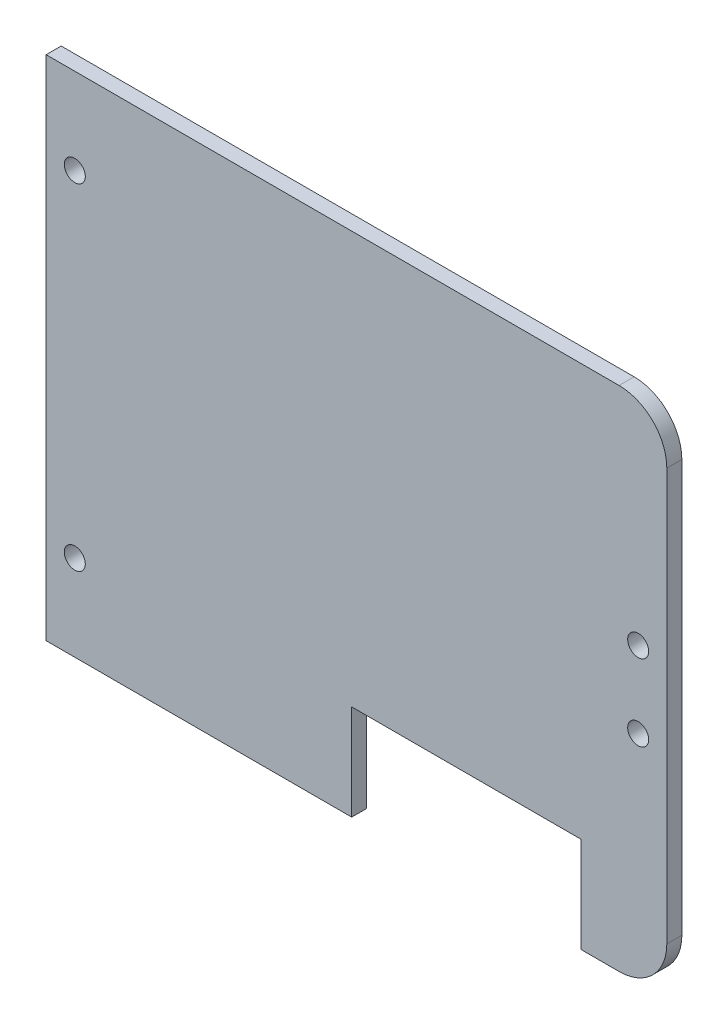
ISO-10303-21;
HEADER;
FILE_DESCRIPTION(('STEP AP214'),'2;1');
FILE_NAME('part.step','',(''),(''),'','','');
FILE_SCHEMA(('AUTOMOTIVE_DESIGN { 1 0 10303 214 1 1 1 1 }'));
ENDSEC;
DATA;
#1=APPLICATION_CONTEXT('core data for automotive mechanical design processes');
#2=APPLICATION_PROTOCOL_DEFINITION('international standard','automotive_design',2000,#1);
#3=PRODUCT_CONTEXT('',#1,'mechanical');
#4=PRODUCT('Part','Part','',(#3));
#5=PRODUCT_RELATED_PRODUCT_CATEGORY('part','',(#4));
#6=PRODUCT_DEFINITION_FORMATION('','',#4);
#7=PRODUCT_DEFINITION_CONTEXT('part definition',#1,'design');
#8=PRODUCT_DEFINITION('design','',#6,#7);
#9=PRODUCT_DEFINITION_SHAPE('','',#8);
#10=(LENGTH_UNIT() NAMED_UNIT(*) SI_UNIT(.MILLI.,.METRE.));
#11=(NAMED_UNIT(*) PLANE_ANGLE_UNIT() SI_UNIT($,.RADIAN.));
#12=(NAMED_UNIT(*) SI_UNIT($,.STERADIAN.) SOLID_ANGLE_UNIT());
#13=UNCERTAINTY_MEASURE_WITH_UNIT(LENGTH_MEASURE(1.E-05),#10,'distance_accuracy_value','');
#14=(GEOMETRIC_REPRESENTATION_CONTEXT(3) GLOBAL_UNCERTAINTY_ASSIGNED_CONTEXT((#13)) GLOBAL_UNIT_ASSIGNED_CONTEXT((#10,
#11,#12)) REPRESENTATION_CONTEXT('',''));
#15=CARTESIAN_POINT('',(0.,0.,0.));
#16=DIRECTION('',(0.,0.,1.));
#17=DIRECTION('',(1.,0.,0.));
#18=AXIS2_PLACEMENT_3D('',#15,#16,#17);
#19=CARTESIAN_POINT('',(60.,48.15,-1.5748));
#20=DIRECTION('',(0.,0.,1.));
#21=DIRECTION('',(1.,0.,0.));
#22=AXIS2_PLACEMENT_3D('',#19,#20,#21);
#23=CYLINDRICAL_SURFACE('',#22,5.);
#24=CARTESIAN_POINT('',(60.,48.15,0.));
#25=DIRECTION('',(0.,0.,1.));
#26=DIRECTION('',(1.,0.,0.));
#27=AXIS2_PLACEMENT_3D('',#24,#25,#26);
#28=CIRCLE('',#27,5.);
#29=CARTESIAN_POINT('',(65.,48.15,0.));
#30=VERTEX_POINT('',#29);
#31=CARTESIAN_POINT('',(60.,53.15,0.));
#32=VERTEX_POINT('',#31);
#33=EDGE_CURVE('E143',#30,#32,#28,.T.);
#34=ORIENTED_EDGE('',*,*,#33,.F.);
#35=DIRECTION('',(0.,0.,1.));
#36=VECTOR('',#35,1.);
#37=CARTESIAN_POINT('',(65.,48.15,-1.5748));
#38=LINE('',#37,#36);
#39=CARTESIAN_POINT('',(65.,48.15,-1.5748));
#40=VERTEX_POINT('',#39);
#41=EDGE_CURVE('E11',#40,#30,#38,.T.);
#42=ORIENTED_EDGE('',*,*,#41,.F.);
#43=CARTESIAN_POINT('',(60.,48.15,-1.5748));
#44=DIRECTION('',(0.,0.,1.));
#45=DIRECTION('',(1.,0.,0.));
#46=AXIS2_PLACEMENT_3D('',#43,#44,#45);
#47=CIRCLE('',#46,5.);
#48=CARTESIAN_POINT('',(60.,53.15,-1.5748));
#49=VERTEX_POINT('',#48);
#50=EDGE_CURVE('E170',#40,#49,#47,.T.);
#51=ORIENTED_EDGE('',*,*,#50,.T.);
#52=DIRECTION('',(0.,0.,1.));
#53=VECTOR('',#52,1.);
#54=CARTESIAN_POINT('',(60.,53.15,-1.5748));
#55=LINE('',#54,#53);
#56=EDGE_CURVE('E37',#49,#32,#55,.T.);
#57=ORIENTED_EDGE('',*,*,#56,.T.);
#58=EDGE_LOOP('',(#34,#42,#51,#57));
#59=FACE_BOUND('',#58,.T.);
#60=ADVANCED_FACE('F34',(#59),#23,.T.);
#61=CARTESIAN_POINT('',(65.,48.15,-1.5748));
#62=DIRECTION('',(1.,0.,0.));
#63=DIRECTION('',(0.,0.,-1.));
#64=AXIS2_PLACEMENT_3D('',#61,#62,#63);
#65=PLANE('',#64);
#66=DIRECTION('',(0.,1.,0.));
#67=VECTOR('',#66,1.);
#68=CARTESIAN_POINT('',(65.,48.15,0.));
#69=LINE('',#68,#67);
#70=CARTESIAN_POINT('',(65.,5.,0.));
#71=VERTEX_POINT('',#70);
#72=EDGE_CURVE('E168',#71,#30,#69,.T.);
#73=ORIENTED_EDGE('',*,*,#72,.F.);
#74=DIRECTION('',(0.,0.,1.));
#75=VECTOR('',#74,1.);
#76=CARTESIAN_POINT('',(65.,5.,-1.5748));
#77=LINE('',#76,#75);
#78=CARTESIAN_POINT('',(65.,5.,-1.5748));
#79=VERTEX_POINT('',#78);
#80=EDGE_CURVE('E43',#79,#71,#77,.T.);
#81=ORIENTED_EDGE('',*,*,#80,.F.);
#82=DIRECTION('',(0.,1.,0.));
#83=VECTOR('',#82,1.);
#84=CARTESIAN_POINT('',(65.,48.15,-1.5748));
#85=LINE('',#84,#83);
#86=EDGE_CURVE('E133',#79,#40,#85,.T.);
#87=ORIENTED_EDGE('',*,*,#86,.T.);
#88=ORIENTED_EDGE('',*,*,#41,.T.);
#89=EDGE_LOOP('',(#73,#81,#87,#88));
#90=FACE_BOUND('',#89,.T.);
#91=ADVANCED_FACE('F186',(#90),#65,.T.);
#92=CARTESIAN_POINT('',(60.,5.,-1.5748));
#93=DIRECTION('',(0.,0.,1.));
#94=DIRECTION('',(1.,0.,0.));
#95=AXIS2_PLACEMENT_3D('',#92,#93,#94);
#96=CYLINDRICAL_SURFACE('',#95,5.);
#97=CARTESIAN_POINT('',(60.,5.,0.));
#98=DIRECTION('',(0.,0.,1.));
#99=DIRECTION('',(1.,0.,0.));
#100=AXIS2_PLACEMENT_3D('',#97,#98,#99);
#101=CIRCLE('',#100,5.);
#102=CARTESIAN_POINT('',(60.,0.,0.));
#103=VERTEX_POINT('',#102);
#104=EDGE_CURVE('E120',#103,#71,#101,.T.);
#105=ORIENTED_EDGE('',*,*,#104,.F.);
#106=DIRECTION('',(0.,0.,1.));
#107=VECTOR('',#106,1.);
#108=CARTESIAN_POINT('',(60.,0.,-1.5748));
#109=LINE('',#108,#107);
#110=CARTESIAN_POINT('',(60.,0.,-1.5748));
#111=VERTEX_POINT('',#110);
#112=EDGE_CURVE('E115',#111,#103,#109,.T.);
#113=ORIENTED_EDGE('',*,*,#112,.F.);
#114=CARTESIAN_POINT('',(60.,5.,-1.5748));
#115=DIRECTION('',(0.,0.,1.));
#116=DIRECTION('',(1.,0.,0.));
#117=AXIS2_PLACEMENT_3D('',#114,#115,#116);
#118=CIRCLE('',#117,5.);
#119=EDGE_CURVE('E118',#111,#79,#118,.T.);
#120=ORIENTED_EDGE('',*,*,#119,.T.);
#121=ORIENTED_EDGE('',*,*,#80,.T.);
#122=EDGE_LOOP('',(#105,#113,#120,#121));
#123=FACE_BOUND('',#122,.T.);
#124=ADVANCED_FACE('F117',(#123),#96,.T.);
#125=CARTESIAN_POINT('',(60.,0.,-1.5748));
#126=DIRECTION('',(0.,-1.,0.));
#127=DIRECTION('',(0.,0.,-1.));
#128=AXIS2_PLACEMENT_3D('',#125,#126,#127);
#129=PLANE('',#128);
#130=DIRECTION('',(1.,0.,0.));
#131=VECTOR('',#130,1.);
#132=CARTESIAN_POINT('',(60.,0.,0.));
#133=LINE('',#132,#131);
#134=CARTESIAN_POINT('',(56.,0.,0.));
#135=VERTEX_POINT('',#134);
#136=EDGE_CURVE('E165',#135,#103,#133,.T.);
#137=ORIENTED_EDGE('',*,*,#136,.F.);
#138=DIRECTION('',(0.,0.,1.));
#139=VECTOR('',#138,1.);
#140=CARTESIAN_POINT('',(56.,0.,-1.5748));
#141=LINE('',#140,#139);
#142=CARTESIAN_POINT('',(56.,0.,-1.5748));
#143=VERTEX_POINT('',#142);
#144=EDGE_CURVE('E125',#143,#135,#141,.T.);
#145=ORIENTED_EDGE('',*,*,#144,.F.);
#146=DIRECTION('',(1.,0.,0.));
#147=VECTOR('',#146,1.);
#148=CARTESIAN_POINT('',(60.,0.,-1.5748));
#149=LINE('',#148,#147);
#150=EDGE_CURVE('E131',#143,#111,#149,.T.);
#151=ORIENTED_EDGE('',*,*,#150,.T.);
#152=ORIENTED_EDGE('',*,*,#112,.T.);
#153=EDGE_LOOP('',(#137,#145,#151,#152));
#154=FACE_BOUND('',#153,.T.);
#155=ADVANCED_FACE('F135',(#154),#129,.T.);
#156=CARTESIAN_POINT('',(56.,0.,-1.5748));
#157=DIRECTION('',(-1.,0.,0.));
#158=DIRECTION('',(0.,0.,1.));
#159=AXIS2_PLACEMENT_3D('',#156,#157,#158);
#160=PLANE('',#159);
#161=DIRECTION('',(0.,-1.,0.));
#162=VECTOR('',#161,1.);
#163=CARTESIAN_POINT('',(56.,0.,0.));
#164=LINE('',#163,#162);
#165=CARTESIAN_POINT('',(56.,10.,0.));
#166=VERTEX_POINT('',#165);
#167=EDGE_CURVE('E162',#166,#135,#164,.T.);
#168=ORIENTED_EDGE('',*,*,#167,.F.);
#169=DIRECTION('',(0.,0.,1.));
#170=VECTOR('',#169,1.);
#171=CARTESIAN_POINT('',(56.,10.,-1.5748));
#172=LINE('',#171,#170);
#173=CARTESIAN_POINT('',(56.,10.,-1.5748));
#174=VERTEX_POINT('',#173);
#175=EDGE_CURVE('E174',#174,#166,#172,.T.);
#176=ORIENTED_EDGE('',*,*,#175,.F.);
#177=DIRECTION('',(0.,-1.,0.));
#178=VECTOR('',#177,1.);
#179=CARTESIAN_POINT('',(56.,0.,-1.5748));
#180=LINE('',#179,#178);
#181=EDGE_CURVE('E136',#174,#143,#180,.T.);
#182=ORIENTED_EDGE('',*,*,#181,.T.);
#183=ORIENTED_EDGE('',*,*,#144,.T.);
#184=EDGE_LOOP('',(#168,#176,#182,#183));
#185=FACE_BOUND('',#184,.T.);
#186=ADVANCED_FACE('F199',(#185),#160,.T.);
#187=CARTESIAN_POINT('',(56.,10.,-1.5748));
#188=DIRECTION('',(0.,-1.,0.));
#189=DIRECTION('',(0.,0.,-1.));
#190=AXIS2_PLACEMENT_3D('',#187,#188,#189);
#191=PLANE('',#190);
#192=DIRECTION('',(1.,0.,0.));
#193=VECTOR('',#192,1.);
#194=CARTESIAN_POINT('',(56.,10.,0.));
#195=LINE('',#194,#193);
#196=CARTESIAN_POINT('',(32.,10.,0.));
#197=VERTEX_POINT('',#196);
#198=EDGE_CURVE('E159',#197,#166,#195,.T.);
#199=ORIENTED_EDGE('',*,*,#198,.F.);
#200=DIRECTION('',(0.,0.,1.));
#201=VECTOR('',#200,1.);
#202=CARTESIAN_POINT('',(32.,10.,-1.5748));
#203=LINE('',#202,#201);
#204=CARTESIAN_POINT('',(32.,10.,-1.5748));
#205=VERTEX_POINT('',#204);
#206=EDGE_CURVE('E176',#205,#197,#203,.T.);
#207=ORIENTED_EDGE('',*,*,#206,.F.);
#208=DIRECTION('',(1.,0.,0.));
#209=VECTOR('',#208,1.);
#210=CARTESIAN_POINT('',(56.,10.,-1.5748));
#211=LINE('',#210,#209);
#212=EDGE_CURVE('E138',#205,#174,#211,.T.);
#213=ORIENTED_EDGE('',*,*,#212,.T.);
#214=ORIENTED_EDGE('',*,*,#175,.T.);
#215=EDGE_LOOP('',(#199,#207,#213,#214));
#216=FACE_BOUND('',#215,.T.);
#217=ADVANCED_FACE('F202',(#216),#191,.T.);
#218=CARTESIAN_POINT('',(32.,10.,-1.5748));
#219=DIRECTION('',(1.,0.,0.));
#220=DIRECTION('',(0.,0.,-1.));
#221=AXIS2_PLACEMENT_3D('',#218,#219,#220);
#222=PLANE('',#221);
#223=DIRECTION('',(0.,1.,0.));
#224=VECTOR('',#223,1.);
#225=CARTESIAN_POINT('',(32.,10.,0.));
#226=LINE('',#225,#224);
#227=CARTESIAN_POINT('',(32.,0.,0.));
#228=VERTEX_POINT('',#227);
#229=EDGE_CURVE('E156',#228,#197,#226,.T.);
#230=ORIENTED_EDGE('',*,*,#229,.F.);
#231=DIRECTION('',(0.,0.,1.));
#232=VECTOR('',#231,1.);
#233=CARTESIAN_POINT('',(32.,0.,-1.5748));
#234=LINE('',#233,#232);
#235=CARTESIAN_POINT('',(32.,0.,-1.5748));
#236=VERTEX_POINT('',#235);
#237=EDGE_CURVE('E178',#236,#228,#234,.T.);
#238=ORIENTED_EDGE('',*,*,#237,.F.);
#239=DIRECTION('',(0.,1.,0.));
#240=VECTOR('',#239,1.);
#241=CARTESIAN_POINT('',(32.,10.,-1.5748));
#242=LINE('',#241,#240);
#243=EDGE_CURVE('E282',#236,#205,#242,.T.);
#244=ORIENTED_EDGE('',*,*,#243,.T.);
#245=ORIENTED_EDGE('',*,*,#206,.T.);
#246=EDGE_LOOP('',(#230,#238,#244,#245));
#247=FACE_BOUND('',#246,.T.);
#248=ADVANCED_FACE('F206',(#247),#222,.T.);
#249=CARTESIAN_POINT('',(32.,0.,-1.5748));
#250=DIRECTION('',(0.,-1.,0.));
#251=DIRECTION('',(0.,0.,-1.));
#252=AXIS2_PLACEMENT_3D('',#249,#250,#251);
#253=PLANE('',#252);
#254=DIRECTION('',(1.,0.,0.));
#255=VECTOR('',#254,1.);
#256=CARTESIAN_POINT('',(32.,0.,0.));
#257=LINE('',#256,#255);
#258=CARTESIAN_POINT('',(0.,0.,0.));
#259=VERTEX_POINT('',#258);
#260=EDGE_CURVE('E153',#259,#228,#257,.T.);
#261=ORIENTED_EDGE('',*,*,#260,.F.);
#262=DIRECTION('',(0.,0.,1.));
#263=VECTOR('',#262,1.);
#264=CARTESIAN_POINT('',(0.,0.,-1.5748));
#265=LINE('',#264,#263);
#266=CARTESIAN_POINT('',(0.,0.,-1.5748));
#267=VERTEX_POINT('',#266);
#268=EDGE_CURVE('E180',#267,#259,#265,.T.);
#269=ORIENTED_EDGE('',*,*,#268,.F.);
#270=DIRECTION('',(1.,0.,0.));
#271=VECTOR('',#270,1.);
#272=CARTESIAN_POINT('',(32.,0.,-1.5748));
#273=LINE('',#272,#271);
#274=EDGE_CURVE('E279',#267,#236,#273,.T.);
#275=ORIENTED_EDGE('',*,*,#274,.T.);
#276=ORIENTED_EDGE('',*,*,#237,.T.);
#277=EDGE_LOOP('',(#261,#269,#275,#276));
#278=FACE_BOUND('',#277,.T.);
#279=ADVANCED_FACE('F210',(#278),#253,.T.);
#280=CARTESIAN_POINT('',(0.,0.,-1.5748));
#281=DIRECTION('',(-1.,0.,0.));
#282=DIRECTION('',(0.,0.,1.));
#283=AXIS2_PLACEMENT_3D('',#280,#281,#282);
#284=PLANE('',#283);
#285=DIRECTION('',(0.,-1.,0.));
#286=VECTOR('',#285,1.);
#287=CARTESIAN_POINT('',(0.,0.,0.));
#288=LINE('',#287,#286);
#289=CARTESIAN_POINT('',(0.,53.15,0.));
#290=VERTEX_POINT('',#289);
#291=EDGE_CURVE('E150',#290,#259,#288,.T.);
#292=ORIENTED_EDGE('',*,*,#291,.F.);
#293=DIRECTION('',(0.,0.,1.));
#294=VECTOR('',#293,1.);
#295=CARTESIAN_POINT('',(0.,53.15,-1.5748));
#296=LINE('',#295,#294);
#297=CARTESIAN_POINT('',(0.,53.15,-1.5748));
#298=VERTEX_POINT('',#297);
#299=EDGE_CURVE('E181',#298,#290,#296,.T.);
#300=ORIENTED_EDGE('',*,*,#299,.F.);
#301=DIRECTION('',(0.,-1.,0.));
#302=VECTOR('',#301,1.);
#303=CARTESIAN_POINT('',(0.,0.,-1.5748));
#304=LINE('',#303,#302);
#305=EDGE_CURVE('E276',#298,#267,#304,.T.);
#306=ORIENTED_EDGE('',*,*,#305,.T.);
#307=ORIENTED_EDGE('',*,*,#268,.T.);
#308=EDGE_LOOP('',(#292,#300,#306,#307));
#309=FACE_BOUND('',#308,.T.);
#310=ADVANCED_FACE('F214',(#309),#284,.T.);
#311=CARTESIAN_POINT('',(0.,53.15,-1.5748));
#312=DIRECTION('',(0.,1.,0.));
#313=DIRECTION('',(0.,0.,1.));
#314=AXIS2_PLACEMENT_3D('',#311,#312,#313);
#315=PLANE('',#314);
#316=DIRECTION('',(-1.,0.,0.));
#317=VECTOR('',#316,1.);
#318=CARTESIAN_POINT('',(0.,53.15,0.));
#319=LINE('',#318,#317);
#320=EDGE_CURVE('E146',#32,#290,#319,.T.);
#321=ORIENTED_EDGE('',*,*,#320,.F.);
#322=ORIENTED_EDGE('',*,*,#56,.F.);
#323=DIRECTION('',(-1.,0.,0.));
#324=VECTOR('',#323,1.);
#325=CARTESIAN_POINT('',(0.,53.15,-1.5748));
#326=LINE('',#325,#324);
#327=EDGE_CURVE('E274',#49,#298,#326,.T.);
#328=ORIENTED_EDGE('',*,*,#327,.T.);
#329=ORIENTED_EDGE('',*,*,#299,.T.);
#330=EDGE_LOOP('',(#321,#322,#328,#329));
#331=FACE_BOUND('',#330,.T.);
#332=ADVANCED_FACE('F183',(#331),#315,.T.);
#333=CARTESIAN_POINT('',(60.,48.15,-1.5748));
#334=DIRECTION('',(0.,0.,1.));
#335=DIRECTION('',(1.,0.,0.));
#336=AXIS2_PLACEMENT_3D('',#333,#334,#335);
#337=PLANE('',#336);
#338=CARTESIAN_POINT('',(62.,30.575,-1.5748));
#339=DIRECTION('',(0.,0.,1.));
#340=DIRECTION('',(1.,0.,0.));
#341=AXIS2_PLACEMENT_3D('',#338,#339,#340);
#342=CIRCLE('',#341,1.1);
#343=CARTESIAN_POINT('',(63.1,30.575,-1.5748));
#344=VERTEX_POINT('',#343);
#345=EDGE_CURVE('E249',#344,#344,#342,.T.);
#346=ORIENTED_EDGE('',*,*,#345,.T.);
#347=EDGE_LOOP('',(#346));
#348=FACE_BOUND('',#347,.T.);
#349=CARTESIAN_POINT('',(3.,44.15,-1.5748));
#350=DIRECTION('',(0.,0.,1.));
#351=DIRECTION('',(1.,0.,0.));
#352=AXIS2_PLACEMENT_3D('',#349,#350,#351);
#353=CIRCLE('',#352,1.1);
#354=CARTESIAN_POINT('',(4.1,44.15,-1.5748));
#355=VERTEX_POINT('',#354);
#356=EDGE_CURVE('E257',#355,#355,#353,.T.);
#357=ORIENTED_EDGE('',*,*,#356,.T.);
#358=EDGE_LOOP('',(#357));
#359=FACE_BOUND('',#358,.T.);
#360=CARTESIAN_POINT('',(62.,22.575,-1.5748));
#361=DIRECTION('',(0.,0.,1.));
#362=DIRECTION('',(1.,0.,0.));
#363=AXIS2_PLACEMENT_3D('',#360,#361,#362);
#364=CIRCLE('',#363,1.1);
#365=CARTESIAN_POINT('',(63.1,22.575,-1.5748));
#366=VERTEX_POINT('',#365);
#367=EDGE_CURVE('E263',#366,#366,#364,.T.);
#368=ORIENTED_EDGE('',*,*,#367,.T.);
#369=EDGE_LOOP('',(#368));
#370=FACE_BOUND('',#369,.T.);
#371=CARTESIAN_POINT('',(3.,9.,-1.5748));
#372=DIRECTION('',(0.,0.,1.));
#373=DIRECTION('',(1.,0.,0.));
#374=AXIS2_PLACEMENT_3D('',#371,#372,#373);
#375=CIRCLE('',#374,1.1);
#376=CARTESIAN_POINT('',(4.1,9.,-1.5748));
#377=VERTEX_POINT('',#376);
#378=EDGE_CURVE('E147',#377,#377,#375,.T.);
#379=ORIENTED_EDGE('',*,*,#378,.T.);
#380=EDGE_LOOP('',(#379));
#381=FACE_BOUND('',#380,.T.);
#382=ORIENTED_EDGE('',*,*,#50,.F.);
#383=ORIENTED_EDGE('',*,*,#86,.F.);
#384=ORIENTED_EDGE('',*,*,#119,.F.);
#385=ORIENTED_EDGE('',*,*,#150,.F.);
#386=ORIENTED_EDGE('',*,*,#181,.F.);
#387=ORIENTED_EDGE('',*,*,#212,.F.);
#388=ORIENTED_EDGE('',*,*,#243,.F.);
#389=ORIENTED_EDGE('',*,*,#274,.F.);
#390=ORIENTED_EDGE('',*,*,#305,.F.);
#391=ORIENTED_EDGE('',*,*,#327,.F.);
#392=EDGE_LOOP('',(#382,#383,#384,#385,#386,#387,#388,#389,#390,#391));
#393=FACE_BOUND('',#392,.T.);
#394=ADVANCED_FACE('F129',(#348,#359,#370,#381,#393),#337,.F.);
#395=CARTESIAN_POINT('',(60.,48.15,0.));
#396=DIRECTION('',(0.,0.,1.));
#397=DIRECTION('',(1.,0.,0.));
#398=AXIS2_PLACEMENT_3D('',#395,#396,#397);
#399=PLANE('',#398);
#400=CARTESIAN_POINT('',(62.,30.575,0.));
#401=DIRECTION('',(0.,0.,1.));
#402=DIRECTION('',(1.,0.,0.));
#403=AXIS2_PLACEMENT_3D('',#400,#401,#402);
#404=CIRCLE('',#403,1.1);
#405=CARTESIAN_POINT('',(63.1,30.575,0.));
#406=VERTEX_POINT('',#405);
#407=EDGE_CURVE('E252',#406,#406,#404,.T.);
#408=ORIENTED_EDGE('',*,*,#407,.F.);
#409=EDGE_LOOP('',(#408));
#410=FACE_BOUND('',#409,.T.);
#411=CARTESIAN_POINT('',(3.,44.15,0.));
#412=DIRECTION('',(0.,0.,1.));
#413=DIRECTION('',(1.,0.,0.));
#414=AXIS2_PLACEMENT_3D('',#411,#412,#413);
#415=CIRCLE('',#414,1.1);
#416=CARTESIAN_POINT('',(4.1,44.15,0.));
#417=VERTEX_POINT('',#416);
#418=EDGE_CURVE('E254',#417,#417,#415,.T.);
#419=ORIENTED_EDGE('',*,*,#418,.F.);
#420=EDGE_LOOP('',(#419));
#421=FACE_BOUND('',#420,.T.);
#422=CARTESIAN_POINT('',(62.,22.575,0.));
#423=DIRECTION('',(0.,0.,1.));
#424=DIRECTION('',(1.,0.,0.));
#425=AXIS2_PLACEMENT_3D('',#422,#423,#424);
#426=CIRCLE('',#425,1.1);
#427=CARTESIAN_POINT('',(63.1,22.575,0.));
#428=VERTEX_POINT('',#427);
#429=EDGE_CURVE('E260',#428,#428,#426,.T.);
#430=ORIENTED_EDGE('',*,*,#429,.F.);
#431=EDGE_LOOP('',(#430));
#432=FACE_BOUND('',#431,.T.);
#433=CARTESIAN_POINT('',(3.,9.,0.));
#434=DIRECTION('',(0.,0.,1.));
#435=DIRECTION('',(1.,0.,0.));
#436=AXIS2_PLACEMENT_3D('',#433,#434,#435);
#437=CIRCLE('',#436,1.1);
#438=CARTESIAN_POINT('',(4.1,9.,0.));
#439=VERTEX_POINT('',#438);
#440=EDGE_CURVE('E266',#439,#439,#437,.T.);
#441=ORIENTED_EDGE('',*,*,#440,.F.);
#442=EDGE_LOOP('',(#441));
#443=FACE_BOUND('',#442,.T.);
#444=ORIENTED_EDGE('',*,*,#33,.T.);
#445=ORIENTED_EDGE('',*,*,#320,.T.);
#446=ORIENTED_EDGE('',*,*,#291,.T.);
#447=ORIENTED_EDGE('',*,*,#260,.T.);
#448=ORIENTED_EDGE('',*,*,#229,.T.);
#449=ORIENTED_EDGE('',*,*,#198,.T.);
#450=ORIENTED_EDGE('',*,*,#167,.T.);
#451=ORIENTED_EDGE('',*,*,#136,.T.);
#452=ORIENTED_EDGE('',*,*,#104,.T.);
#453=ORIENTED_EDGE('',*,*,#72,.T.);
#454=EDGE_LOOP('',(#444,#445,#446,#447,#448,#449,#450,#451,#452,#453));
#455=FACE_BOUND('',#454,.T.);
#456=ADVANCED_FACE('F185',(#410,#421,#432,#443,#455),#399,.T.);
#457=CARTESIAN_POINT('',(3.,9.,-1.5748));
#458=DIRECTION('',(0.,0.,1.));
#459=DIRECTION('',(1.,0.,0.));
#460=AXIS2_PLACEMENT_3D('',#457,#458,#459);
#461=CYLINDRICAL_SURFACE('',#460,1.1);
#462=ORIENTED_EDGE('',*,*,#378,.F.);
#463=EDGE_LOOP('',(#462));
#464=FACE_BOUND('',#463,.T.);
#465=ORIENTED_EDGE('',*,*,#440,.T.);
#466=EDGE_LOOP('',(#465));
#467=FACE_BOUND('',#466,.T.);
#468=ADVANCED_FACE('F226',(#464,#467),#461,.F.);
#469=CARTESIAN_POINT('',(62.,22.575,-1.5748));
#470=DIRECTION('',(0.,0.,1.));
#471=DIRECTION('',(1.,0.,0.));
#472=AXIS2_PLACEMENT_3D('',#469,#470,#471);
#473=CYLINDRICAL_SURFACE('',#472,1.1);
#474=ORIENTED_EDGE('',*,*,#367,.F.);
#475=EDGE_LOOP('',(#474));
#476=FACE_BOUND('',#475,.T.);
#477=ORIENTED_EDGE('',*,*,#429,.T.);
#478=EDGE_LOOP('',(#477));
#479=FACE_BOUND('',#478,.T.);
#480=ADVANCED_FACE('F233',(#476,#479),#473,.F.);
#481=CARTESIAN_POINT('',(3.,44.15,-1.5748));
#482=DIRECTION('',(0.,0.,1.));
#483=DIRECTION('',(1.,0.,0.));
#484=AXIS2_PLACEMENT_3D('',#481,#482,#483);
#485=CYLINDRICAL_SURFACE('',#484,1.1);
#486=ORIENTED_EDGE('',*,*,#356,.F.);
#487=EDGE_LOOP('',(#486));
#488=FACE_BOUND('',#487,.T.);
#489=ORIENTED_EDGE('',*,*,#418,.T.);
#490=EDGE_LOOP('',(#489));
#491=FACE_BOUND('',#490,.T.);
#492=ADVANCED_FACE('F237',(#488,#491),#485,.F.);
#493=CARTESIAN_POINT('',(62.,30.575,-1.5748));
#494=DIRECTION('',(0.,0.,1.));
#495=DIRECTION('',(1.,0.,0.));
#496=AXIS2_PLACEMENT_3D('',#493,#494,#495);
#497=CYLINDRICAL_SURFACE('',#496,1.1);
#498=ORIENTED_EDGE('',*,*,#345,.F.);
#499=EDGE_LOOP('',(#498));
#500=FACE_BOUND('',#499,.T.);
#501=ORIENTED_EDGE('',*,*,#407,.T.);
#502=EDGE_LOOP('',(#501));
#503=FACE_BOUND('',#502,.T.);
#504=ADVANCED_FACE('F241',(#500,#503),#497,.F.);
#505=CLOSED_SHELL('',(#60,#91,#124,#155,#186,#217,#248,#279,#310,#332,#394,#456,#468,#480,#492,#504));
#506=MANIFOLD_SOLID_BREP('B2',#505);
#507=ADVANCED_BREP_SHAPE_REPRESENTATION('',(#18,#506),#14);
#508=SHAPE_DEFINITION_REPRESENTATION(#9,#507);
ENDSEC;
END-ISO-10303-21;
